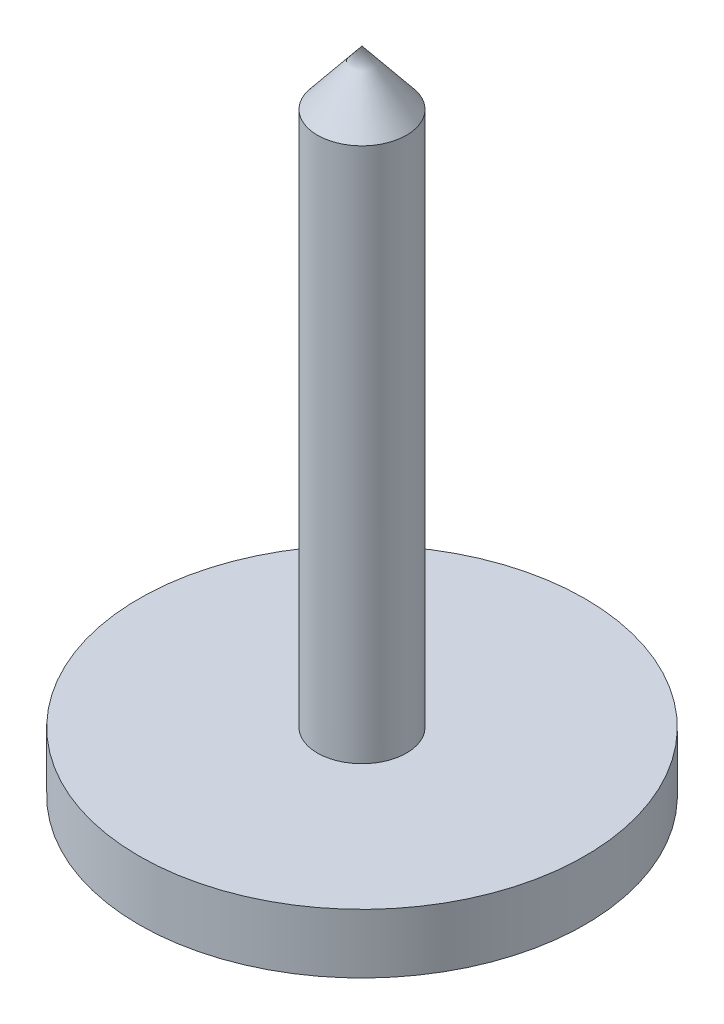
ISO-10303-21;
HEADER;
FILE_DESCRIPTION(('STEP AP214'),'2;1');
FILE_NAME('part.step','',(''),(''),'','','');
FILE_SCHEMA(('AUTOMOTIVE_DESIGN { 1 0 10303 214 1 1 1 1 }'));
ENDSEC;
DATA;
#1=APPLICATION_CONTEXT('core data for automotive mechanical design processes');
#2=APPLICATION_PROTOCOL_DEFINITION('international standard','automotive_design',2000,#1);
#3=PRODUCT_CONTEXT('',#1,'mechanical');
#4=PRODUCT('Part','Part','',(#3));
#5=PRODUCT_RELATED_PRODUCT_CATEGORY('part','',(#4));
#6=PRODUCT_DEFINITION_FORMATION('','',#4);
#7=PRODUCT_DEFINITION_CONTEXT('part definition',#1,'design');
#8=PRODUCT_DEFINITION('design','',#6,#7);
#9=PRODUCT_DEFINITION_SHAPE('','',#8);
#10=(LENGTH_UNIT() NAMED_UNIT(*) SI_UNIT(.MILLI.,.METRE.));
#11=(NAMED_UNIT(*) PLANE_ANGLE_UNIT() SI_UNIT($,.RADIAN.));
#12=(NAMED_UNIT(*) SI_UNIT($,.STERADIAN.) SOLID_ANGLE_UNIT());
#13=UNCERTAINTY_MEASURE_WITH_UNIT(LENGTH_MEASURE(1.E-05),#10,'distance_accuracy_value','');
#14=(GEOMETRIC_REPRESENTATION_CONTEXT(3) GLOBAL_UNCERTAINTY_ASSIGNED_CONTEXT((#13)) GLOBAL_UNIT_ASSIGNED_CONTEXT((#10,
#11,#12)) REPRESENTATION_CONTEXT('',''));
#15=CARTESIAN_POINT('',(0.,0.,0.));
#16=DIRECTION('',(0.,0.,1.));
#17=DIRECTION('',(1.,0.,0.));
#18=AXIS2_PLACEMENT_3D('',#15,#16,#17);
#19=CARTESIAN_POINT('',(0.,0.,0.));
#20=DIRECTION('',(0.,1.,0.));
#21=DIRECTION('',(0.,0.,1.));
#22=AXIS2_PLACEMENT_3D('',#19,#20,#21);
#23=PLANE('',#22);
#24=CARTESIAN_POINT('',(0.,0.,0.));
#25=DIRECTION('',(0.,1.,0.));
#26=DIRECTION('',(0.,0.,1.));
#27=AXIS2_PLACEMENT_3D('',#24,#25,#26);
#28=CIRCLE('',#27,37.5);
#29=CARTESIAN_POINT('',(0.,0.,37.5));
#30=VERTEX_POINT('',#29);
#31=EDGE_CURVE('E11',#30,#30,#28,.T.);
#32=ORIENTED_EDGE('',*,*,#31,.F.);
#33=EDGE_LOOP('',(#32));
#34=FACE_BOUND('',#33,.T.);
#35=ADVANCED_FACE('F33',(#34),#23,.F.);
#36=CARTESIAN_POINT('',(0.,109.239571586471,0.));
#37=DIRECTION('',(0.,1.,0.));
#38=DIRECTION('',(0.,0.,1.));
#39=AXIS2_PLACEMENT_3D('',#36,#37,#38);
#40=CYLINDRICAL_SURFACE('',#39,37.5);
#41=CARTESIAN_POINT('',(0.,9.99999999999999,0.));
#42=DIRECTION('',(0.,1.,0.));
#43=DIRECTION('',(0.,0.,1.));
#44=AXIS2_PLACEMENT_3D('',#41,#42,#43);
#45=CIRCLE('',#44,37.5);
#46=CARTESIAN_POINT('',(0.,9.99999999999999,37.5));
#47=VERTEX_POINT('',#46);
#48=EDGE_CURVE('E39',#47,#47,#45,.T.);
#49=ORIENTED_EDGE('',*,*,#48,.F.);
#50=EDGE_LOOP('',(#49));
#51=FACE_BOUND('',#50,.T.);
#52=ORIENTED_EDGE('',*,*,#31,.T.);
#53=EDGE_LOOP('',(#52));
#54=FACE_BOUND('',#53,.T.);
#55=ADVANCED_FACE('F60',(#51,#54),#40,.T.);
#56=CARTESIAN_POINT('',(37.5,10.,0.));
#57=DIRECTION('',(0.,-1.,0.));
#58=DIRECTION('',(0.,0.,-1.));
#59=AXIS2_PLACEMENT_3D('',#56,#57,#58);
#60=PLANE('',#59);
#61=CARTESIAN_POINT('',(0.,9.99999999999999,0.));
#62=DIRECTION('',(0.,1.,0.));
#63=DIRECTION('',(0.,0.,1.));
#64=AXIS2_PLACEMENT_3D('',#61,#62,#63);
#65=CIRCLE('',#64,7.5);
#66=CARTESIAN_POINT('',(0.,9.99999999999999,7.5));
#67=VERTEX_POINT('',#66);
#68=EDGE_CURVE('E51',#67,#67,#65,.T.);
#69=ORIENTED_EDGE('',*,*,#68,.F.);
#70=EDGE_LOOP('',(#69));
#71=FACE_BOUND('',#70,.T.);
#72=ORIENTED_EDGE('',*,*,#48,.T.);
#73=EDGE_LOOP('',(#72));
#74=FACE_BOUND('',#73,.T.);
#75=ADVANCED_FACE('F58',(#71,#74),#60,.F.);
#76=CARTESIAN_POINT('',(0.,109.239571586471,0.));
#77=DIRECTION('',(0.,1.,0.));
#78=DIRECTION('',(0.,0.,1.));
#79=AXIS2_PLACEMENT_3D('',#76,#77,#78);
#80=CYLINDRICAL_SURFACE('',#79,7.5);
#81=CARTESIAN_POINT('',(0.,100.,0.));
#82=DIRECTION('',(0.,1.,0.));
#83=DIRECTION('',(0.,0.,1.));
#84=AXIS2_PLACEMENT_3D('',#81,#82,#83);
#85=CIRCLE('',#84,7.5);
#86=CARTESIAN_POINT('',(0.,100.,7.5));
#87=VERTEX_POINT('',#86);
#88=EDGE_CURVE('E49',#87,#87,#85,.T.);
#89=ORIENTED_EDGE('',*,*,#88,.F.);
#90=EDGE_LOOP('',(#89));
#91=FACE_BOUND('',#90,.T.);
#92=ORIENTED_EDGE('',*,*,#68,.T.);
#93=EDGE_LOOP('',(#92));
#94=FACE_BOUND('',#93,.T.);
#95=ADVANCED_FACE('F45',(#91,#94),#80,.T.);
#96=CARTESIAN_POINT('',(0.,100.,0.));
#97=DIRECTION('',(0.,-1.,0.));
#98=DIRECTION('',(0.,0.,-1.));
#99=AXIS2_PLACEMENT_3D('',#96,#97,#98);
#100=CONICAL_SURFACE('',#99,7.5,0.681850125376819);
#101=CARTESIAN_POINT('',(0.,109.239571586471,0.));
#102=VERTEX_POINT('',#101);
#103=VERTEX_LOOP('',#102);
#104=FACE_BOUND('',#103,.T.);
#105=ORIENTED_EDGE('',*,*,#88,.T.);
#106=EDGE_LOOP('',(#105));
#107=FACE_BOUND('',#106,.T.);
#108=ADVANCED_FACE('F42',(#104,#107),#100,.T.);
#109=CLOSED_SHELL('',(#35,#55,#75,#95,#108));
#110=MANIFOLD_SOLID_BREP('B2',#109);
#111=ADVANCED_BREP_SHAPE_REPRESENTATION('',(#18,#110),#14);
#112=SHAPE_DEFINITION_REPRESENTATION(#9,#111);
ENDSEC;
END-ISO-10303-21;
